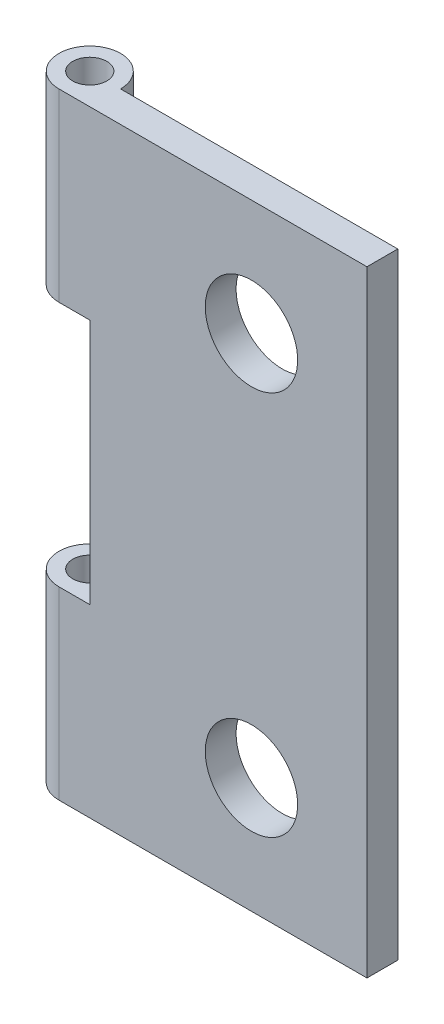
ISO-10303-21;
HEADER;
FILE_DESCRIPTION(('STEP AP214'),'2;1');
FILE_NAME('part.step','',(''),(''),'','','');
FILE_SCHEMA(('AUTOMOTIVE_DESIGN { 1 0 10303 214 1 1 1 1 }'));
ENDSEC;
DATA;
#1=APPLICATION_CONTEXT('core data for automotive mechanical design processes');
#2=APPLICATION_PROTOCOL_DEFINITION('international standard','automotive_design',2000,#1);
#3=PRODUCT_CONTEXT('',#1,'mechanical');
#4=PRODUCT('Part','Part','',(#3));
#5=PRODUCT_RELATED_PRODUCT_CATEGORY('part','',(#4));
#6=PRODUCT_DEFINITION_FORMATION('','',#4);
#7=PRODUCT_DEFINITION_CONTEXT('part definition',#1,'design');
#8=PRODUCT_DEFINITION('design','',#6,#7);
#9=PRODUCT_DEFINITION_SHAPE('','',#8);
#10=(LENGTH_UNIT() NAMED_UNIT(*) SI_UNIT(.MILLI.,.METRE.));
#11=(NAMED_UNIT(*) PLANE_ANGLE_UNIT() SI_UNIT($,.RADIAN.));
#12=(NAMED_UNIT(*) SI_UNIT($,.STERADIAN.) SOLID_ANGLE_UNIT());
#13=UNCERTAINTY_MEASURE_WITH_UNIT(LENGTH_MEASURE(1.E-05),#10,'distance_accuracy_value','');
#14=(GEOMETRIC_REPRESENTATION_CONTEXT(3) GLOBAL_UNCERTAINTY_ASSIGNED_CONTEXT((#13)) GLOBAL_UNIT_ASSIGNED_CONTEXT((#10,
#11,#12)) REPRESENTATION_CONTEXT('',''));
#15=CARTESIAN_POINT('',(0.,0.,0.));
#16=DIRECTION('',(0.,0.,1.));
#17=DIRECTION('',(1.,0.,0.));
#18=AXIS2_PLACEMENT_3D('',#15,#16,#17);
#19=CARTESIAN_POINT('',(-10.,40.,-1.));
#20=DIRECTION('',(0.,-1.,0.));
#21=DIRECTION('',(0.,0.,-1.));
#22=AXIS2_PLACEMENT_3D('',#19,#20,#21);
#23=CYLINDRICAL_SURFACE('',#22,2.);
#24=CARTESIAN_POINT('',(-10.,12.,-1.));
#25=DIRECTION('',(0.,1.,0.));
#26=DIRECTION('',(0.,0.,1.));
#27=AXIS2_PLACEMENT_3D('',#24,#25,#26);
#28=CIRCLE('',#27,2.);
#29=CARTESIAN_POINT('',(-8.,12.,-1.));
#30=VERTEX_POINT('',#29);
#31=CARTESIAN_POINT('',(-10.,12.,1.));
#32=VERTEX_POINT('',#31);
#33=EDGE_CURVE('E126',#30,#32,#28,.T.);
#34=ORIENTED_EDGE('',*,*,#33,.F.);
#35=DIRECTION('',(0.,-1.,0.));
#36=VECTOR('',#35,1.);
#37=CARTESIAN_POINT('',(-8.,40.,-1.));
#38=LINE('',#37,#36);
#39=CARTESIAN_POINT('',(-8.,0.,-1.));
#40=VERTEX_POINT('',#39);
#41=EDGE_CURVE('E96',#30,#40,#38,.T.);
#42=ORIENTED_EDGE('',*,*,#41,.T.);
#43=CARTESIAN_POINT('',(-10.,0.,-1.));
#44=DIRECTION('',(0.,1.,0.));
#45=DIRECTION('',(0.,0.,1.));
#46=AXIS2_PLACEMENT_3D('',#43,#44,#45);
#47=CIRCLE('',#46,2.);
#48=CARTESIAN_POINT('',(-10.,0.,1.));
#49=VERTEX_POINT('',#48);
#50=EDGE_CURVE('E125',#40,#49,#47,.T.);
#51=ORIENTED_EDGE('',*,*,#50,.T.);
#52=DIRECTION('',(0.,-1.,0.));
#53=VECTOR('',#52,1.);
#54=CARTESIAN_POINT('',(-10.,40.,1.));
#55=LINE('',#54,#53);
#56=EDGE_CURVE('E56',#32,#49,#55,.T.);
#57=ORIENTED_EDGE('',*,*,#56,.F.);
#58=EDGE_LOOP('',(#34,#42,#51,#57));
#59=FACE_BOUND('',#58,.T.);
#60=ADVANCED_FACE('F47',(#59),#23,.T.);
#61=CARTESIAN_POINT('',(0.,40.,1.));
#62=DIRECTION('',(0.,0.,-1.));
#63=DIRECTION('',(-1.,0.,0.));
#64=AXIS2_PLACEMENT_3D('',#61,#62,#63);
#65=PLANE('',#64);
#66=CARTESIAN_POINT('',(2.5,32.5,1.));
#67=DIRECTION('',(0.,0.,-1.));
#68=DIRECTION('',(-1.,0.,0.));
#69=AXIS2_PLACEMENT_3D('',#66,#67,#68);
#70=CIRCLE('',#69,3.);
#71=CARTESIAN_POINT('',(-0.500000000000003,32.5,1.));
#72=VERTEX_POINT('',#71);
#73=EDGE_CURVE('E133',#72,#72,#70,.T.);
#74=ORIENTED_EDGE('',*,*,#73,.T.);
#75=EDGE_LOOP('',(#74));
#76=FACE_BOUND('',#75,.T.);
#77=CARTESIAN_POINT('',(2.5,7.5,1.));
#78=DIRECTION('',(0.,0.,-1.));
#79=DIRECTION('',(-1.,0.,0.));
#80=AXIS2_PLACEMENT_3D('',#77,#78,#79);
#81=CIRCLE('',#80,3.);
#82=CARTESIAN_POINT('',(-0.500000000000002,7.5,1.));
#83=VERTEX_POINT('',#82);
#84=EDGE_CURVE('E242',#83,#83,#81,.T.);
#85=ORIENTED_EDGE('',*,*,#84,.T.);
#86=EDGE_LOOP('',(#85));
#87=FACE_BOUND('',#86,.T.);
#88=DIRECTION('',(1.,0.,0.));
#89=VECTOR('',#88,1.);
#90=CARTESIAN_POINT('',(0.,12.,1.));
#91=LINE('',#90,#89);
#92=CARTESIAN_POINT('',(-8.,12.,1.));
#93=VERTEX_POINT('',#92);
#94=EDGE_CURVE('E143',#32,#93,#91,.T.);
#95=ORIENTED_EDGE('',*,*,#94,.F.);
#96=ORIENTED_EDGE('',*,*,#56,.T.);
#97=DIRECTION('',(1.,0.,0.));
#98=VECTOR('',#97,1.);
#99=CARTESIAN_POINT('',(0.,0.,1.));
#100=LINE('',#99,#98);
#101=CARTESIAN_POINT('',(10.,0.,1.));
#102=VERTEX_POINT('',#101);
#103=EDGE_CURVE('E159',#49,#102,#100,.T.);
#104=ORIENTED_EDGE('',*,*,#103,.T.);
#105=DIRECTION('',(0.,-1.,0.));
#106=VECTOR('',#105,1.);
#107=CARTESIAN_POINT('',(10.,40.,1.));
#108=LINE('',#107,#106);
#109=CARTESIAN_POINT('',(10.,40.,1.));
#110=VERTEX_POINT('',#109);
#111=EDGE_CURVE('E174',#110,#102,#108,.T.);
#112=ORIENTED_EDGE('',*,*,#111,.F.);
#113=DIRECTION('',(1.,0.,0.));
#114=VECTOR('',#113,1.);
#115=CARTESIAN_POINT('',(0.,40.,1.));
#116=LINE('',#115,#114);
#117=CARTESIAN_POINT('',(-10.,40.,1.));
#118=VERTEX_POINT('',#117);
#119=EDGE_CURVE('E103',#118,#110,#116,.T.);
#120=ORIENTED_EDGE('',*,*,#119,.F.);
#121=CARTESIAN_POINT('',(-10.,28.,1.));
#122=VERTEX_POINT('',#121);
#123=EDGE_CURVE('E11',#118,#122,#55,.T.);
#124=ORIENTED_EDGE('',*,*,#123,.T.);
#125=DIRECTION('',(1.,0.,0.));
#126=VECTOR('',#125,1.);
#127=CARTESIAN_POINT('',(0.,28.,1.));
#128=LINE('',#127,#126);
#129=CARTESIAN_POINT('',(-8.,28.,1.));
#130=VERTEX_POINT('',#129);
#131=EDGE_CURVE('E131',#122,#130,#128,.T.);
#132=ORIENTED_EDGE('',*,*,#131,.T.);
#133=DIRECTION('',(0.,-1.,0.));
#134=VECTOR('',#133,1.);
#135=CARTESIAN_POINT('',(-8.,40.,1.));
#136=LINE('',#135,#134);
#137=EDGE_CURVE('E119',#130,#93,#136,.T.);
#138=ORIENTED_EDGE('',*,*,#137,.T.);
#139=EDGE_LOOP('',(#95,#96,#104,#112,#120,#124,#132,#138));
#140=FACE_BOUND('',#139,.T.);
#141=ADVANCED_FACE('F135',(#76,#87,#140),#65,.F.);
#142=CARTESIAN_POINT('',(-10.,40.,-1.));
#143=DIRECTION('',(0.,-1.,0.));
#144=DIRECTION('',(0.,0.,-1.));
#145=AXIS2_PLACEMENT_3D('',#142,#143,#144);
#146=CYLINDRICAL_SURFACE('',#145,1.10743887362337);
#147=CARTESIAN_POINT('',(-10.,0.,-1.));
#148=DIRECTION('',(0.,1.,0.));
#149=DIRECTION('',(0.,0.,1.));
#150=AXIS2_PLACEMENT_3D('',#147,#148,#149);
#151=CIRCLE('',#150,1.10743887362337);
#152=CARTESIAN_POINT('',(-10.,0.,0.10743887362337));
#153=VERTEX_POINT('',#152);
#154=EDGE_CURVE('E148',#153,#153,#151,.T.);
#155=ORIENTED_EDGE('',*,*,#154,.F.);
#156=EDGE_LOOP('',(#155));
#157=FACE_BOUND('',#156,.T.);
#158=CARTESIAN_POINT('',(-10.,12.,-1.));
#159=DIRECTION('',(0.,1.,0.));
#160=DIRECTION('',(0.,0.,1.));
#161=AXIS2_PLACEMENT_3D('',#158,#159,#160);
#162=CIRCLE('',#161,1.10743887362337);
#163=CARTESIAN_POINT('',(-10.,12.,0.10743887362337));
#164=VERTEX_POINT('',#163);
#165=EDGE_CURVE('E51',#164,#164,#162,.T.);
#166=ORIENTED_EDGE('',*,*,#165,.T.);
#167=EDGE_LOOP('',(#166));
#168=FACE_BOUND('',#167,.T.);
#169=ADVANCED_FACE('F189',(#157,#168),#146,.F.);
#170=CARTESIAN_POINT('',(-8.,40.,-1.));
#171=VERTEX_POINT('',#170);
#172=CARTESIAN_POINT('',(-8.,28.,-1.));
#173=VERTEX_POINT('',#172);
#174=EDGE_CURVE('E73',#171,#173,#38,.T.);
#175=ORIENTED_EDGE('',*,*,#174,.T.);
#176=CARTESIAN_POINT('',(-10.,28.,-1.));
#177=DIRECTION('',(0.,1.,0.));
#178=DIRECTION('',(0.,0.,1.));
#179=AXIS2_PLACEMENT_3D('',#176,#177,#178);
#180=CIRCLE('',#179,2.);
#181=EDGE_CURVE('E132',#173,#122,#180,.T.);
#182=ORIENTED_EDGE('',*,*,#181,.T.);
#183=ORIENTED_EDGE('',*,*,#123,.F.);
#184=CARTESIAN_POINT('',(-10.,40.,-1.));
#185=DIRECTION('',(0.,1.,0.));
#186=DIRECTION('',(0.,0.,1.));
#187=AXIS2_PLACEMENT_3D('',#184,#185,#186);
#188=CIRCLE('',#187,2.);
#189=EDGE_CURVE('E146',#171,#118,#188,.T.);
#190=ORIENTED_EDGE('',*,*,#189,.F.);
#191=EDGE_LOOP('',(#175,#182,#183,#190));
#192=FACE_BOUND('',#191,.T.);
#193=ADVANCED_FACE('F49',(#192),#23,.T.);
#194=CARTESIAN_POINT('',(10.,40.,0.));
#195=DIRECTION('',(1.,0.,0.));
#196=DIRECTION('',(0.,0.,-1.));
#197=AXIS2_PLACEMENT_3D('',#194,#195,#196);
#198=PLANE('',#197);
#199=DIRECTION('',(0.,0.,1.));
#200=VECTOR('',#199,1.);
#201=CARTESIAN_POINT('',(10.,0.,0.));
#202=LINE('',#201,#200);
#203=CARTESIAN_POINT('',(10.,0.,-1.));
#204=VERTEX_POINT('',#203);
#205=EDGE_CURVE('E162',#204,#102,#202,.T.);
#206=ORIENTED_EDGE('',*,*,#205,.F.);
#207=DIRECTION('',(0.,-1.,0.));
#208=VECTOR('',#207,1.);
#209=CARTESIAN_POINT('',(10.,40.,-1.));
#210=LINE('',#209,#208);
#211=CARTESIAN_POINT('',(10.,40.,-1.));
#212=VERTEX_POINT('',#211);
#213=EDGE_CURVE('E171',#212,#204,#210,.T.);
#214=ORIENTED_EDGE('',*,*,#213,.F.);
#215=DIRECTION('',(0.,0.,1.));
#216=VECTOR('',#215,1.);
#217=CARTESIAN_POINT('',(10.,40.,0.));
#218=LINE('',#217,#216);
#219=EDGE_CURVE('E150',#212,#110,#218,.T.);
#220=ORIENTED_EDGE('',*,*,#219,.T.);
#221=ORIENTED_EDGE('',*,*,#111,.T.);
#222=EDGE_LOOP('',(#206,#214,#220,#221));
#223=FACE_BOUND('',#222,.T.);
#224=ADVANCED_FACE('F192',(#223),#198,.T.);
#225=CARTESIAN_POINT('',(0.,40.,-1.));
#226=DIRECTION('',(0.,0.,-1.));
#227=DIRECTION('',(-1.,0.,0.));
#228=AXIS2_PLACEMENT_3D('',#225,#226,#227);
#229=PLANE('',#228);
#230=CARTESIAN_POINT('',(2.5,32.5,-1.));
#231=DIRECTION('',(0.,0.,-1.));
#232=DIRECTION('',(-1.,0.,0.));
#233=AXIS2_PLACEMENT_3D('',#230,#231,#232);
#234=CIRCLE('',#233,3.);
#235=CARTESIAN_POINT('',(-0.500000000000003,32.5,-1.));
#236=VERTEX_POINT('',#235);
#237=EDGE_CURVE('E236',#236,#236,#234,.T.);
#238=ORIENTED_EDGE('',*,*,#237,.F.);
#239=EDGE_LOOP('',(#238));
#240=FACE_BOUND('',#239,.T.);
#241=CARTESIAN_POINT('',(2.5,7.5,-1.));
#242=DIRECTION('',(0.,0.,-1.));
#243=DIRECTION('',(-1.,0.,0.));
#244=AXIS2_PLACEMENT_3D('',#241,#242,#243);
#245=CIRCLE('',#244,3.);
#246=CARTESIAN_POINT('',(-0.500000000000002,7.5,-1.));
#247=VERTEX_POINT('',#246);
#248=EDGE_CURVE('E239',#247,#247,#245,.T.);
#249=ORIENTED_EDGE('',*,*,#248,.F.);
#250=EDGE_LOOP('',(#249));
#251=FACE_BOUND('',#250,.T.);
#252=DIRECTION('',(1.,0.,0.));
#253=VECTOR('',#252,1.);
#254=CARTESIAN_POINT('',(0.,0.,-1.));
#255=LINE('',#254,#253);
#256=EDGE_CURVE('E165',#40,#204,#255,.T.);
#257=ORIENTED_EDGE('',*,*,#256,.F.);
#258=ORIENTED_EDGE('',*,*,#41,.F.);
#259=EDGE_CURVE('E172',#173,#30,#38,.T.);
#260=ORIENTED_EDGE('',*,*,#259,.F.);
#261=ORIENTED_EDGE('',*,*,#174,.F.);
#262=DIRECTION('',(1.,0.,0.));
#263=VECTOR('',#262,1.);
#264=CARTESIAN_POINT('',(0.,40.,-1.));
#265=LINE('',#264,#263);
#266=EDGE_CURVE('E153',#171,#212,#265,.T.);
#267=ORIENTED_EDGE('',*,*,#266,.T.);
#268=ORIENTED_EDGE('',*,*,#213,.T.);
#269=EDGE_LOOP('',(#257,#258,#260,#261,#267,#268));
#270=FACE_BOUND('',#269,.T.);
#271=ADVANCED_FACE('F198',(#240,#251,#270),#229,.T.);
#272=CARTESIAN_POINT('',(-10.,28.,-1.));
#273=DIRECTION('',(0.,1.,0.));
#274=DIRECTION('',(0.,0.,1.));
#275=AXIS2_PLACEMENT_3D('',#272,#273,#274);
#276=CIRCLE('',#275,1.10743887362337);
#277=CARTESIAN_POINT('',(-10.,28.,0.10743887362337));
#278=VERTEX_POINT('',#277);
#279=EDGE_CURVE('E137',#278,#278,#276,.T.);
#280=ORIENTED_EDGE('',*,*,#279,.F.);
#281=EDGE_LOOP('',(#280));
#282=FACE_BOUND('',#281,.T.);
#283=CARTESIAN_POINT('',(-10.,40.,-1.));
#284=DIRECTION('',(0.,1.,0.));
#285=DIRECTION('',(0.,0.,1.));
#286=AXIS2_PLACEMENT_3D('',#283,#284,#285);
#287=CIRCLE('',#286,1.10743887362337);
#288=CARTESIAN_POINT('',(-10.,40.,0.10743887362337));
#289=VERTEX_POINT('',#288);
#290=EDGE_CURVE('E155',#289,#289,#287,.T.);
#291=ORIENTED_EDGE('',*,*,#290,.T.);
#292=EDGE_LOOP('',(#291));
#293=FACE_BOUND('',#292,.T.);
#294=ADVANCED_FACE('F202',(#282,#293),#146,.F.);
#295=CARTESIAN_POINT('',(0.,40.,0.));
#296=DIRECTION('',(0.,1.,0.));
#297=DIRECTION('',(0.,0.,1.));
#298=AXIS2_PLACEMENT_3D('',#295,#296,#297);
#299=PLANE('',#298);
#300=ORIENTED_EDGE('',*,*,#189,.T.);
#301=ORIENTED_EDGE('',*,*,#119,.T.);
#302=ORIENTED_EDGE('',*,*,#219,.F.);
#303=ORIENTED_EDGE('',*,*,#266,.F.);
#304=EDGE_LOOP('',(#300,#301,#302,#303));
#305=FACE_BOUND('',#304,.T.);
#306=ORIENTED_EDGE('',*,*,#290,.F.);
#307=EDGE_LOOP('',(#306));
#308=FACE_BOUND('',#307,.T.);
#309=ADVANCED_FACE('F206',(#305,#308),#299,.T.);
#310=CARTESIAN_POINT('',(0.,0.,0.));
#311=DIRECTION('',(0.,1.,0.));
#312=DIRECTION('',(0.,0.,1.));
#313=AXIS2_PLACEMENT_3D('',#310,#311,#312);
#314=PLANE('',#313);
#315=ORIENTED_EDGE('',*,*,#50,.F.);
#316=ORIENTED_EDGE('',*,*,#256,.T.);
#317=ORIENTED_EDGE('',*,*,#205,.T.);
#318=ORIENTED_EDGE('',*,*,#103,.F.);
#319=EDGE_LOOP('',(#315,#316,#317,#318));
#320=FACE_BOUND('',#319,.T.);
#321=ORIENTED_EDGE('',*,*,#154,.T.);
#322=EDGE_LOOP('',(#321));
#323=FACE_BOUND('',#322,.T.);
#324=ADVANCED_FACE('F180',(#320,#323),#314,.F.);
#325=CARTESIAN_POINT('',(-8.,0.,-41.));
#326=DIRECTION('',(1.,0.,0.));
#327=DIRECTION('',(0.,0.,-1.));
#328=AXIS2_PLACEMENT_3D('',#325,#326,#327);
#329=PLANE('',#328);
#330=DIRECTION('',(0.,0.,1.));
#331=VECTOR('',#330,1.);
#332=CARTESIAN_POINT('',(-8.,28.,-41.));
#333=LINE('',#332,#331);
#334=EDGE_CURVE('E64',#173,#130,#333,.T.);
#335=ORIENTED_EDGE('',*,*,#334,.F.);
#336=ORIENTED_EDGE('',*,*,#259,.T.);
#337=DIRECTION('',(0.,0.,1.));
#338=VECTOR('',#337,1.);
#339=CARTESIAN_POINT('',(-8.,12.,-41.));
#340=LINE('',#339,#338);
#341=EDGE_CURVE('E122',#30,#93,#340,.T.);
#342=ORIENTED_EDGE('',*,*,#341,.T.);
#343=ORIENTED_EDGE('',*,*,#137,.F.);
#344=EDGE_LOOP('',(#335,#336,#342,#343));
#345=FACE_BOUND('',#344,.T.);
#346=ADVANCED_FACE('F120',(#345),#329,.F.);
#347=CARTESIAN_POINT('',(0.,12.,-41.));
#348=DIRECTION('',(0.,1.,0.));
#349=DIRECTION('',(0.,0.,1.));
#350=AXIS2_PLACEMENT_3D('',#347,#348,#349);
#351=PLANE('',#350);
#352=ORIENTED_EDGE('',*,*,#165,.F.);
#353=EDGE_LOOP('',(#352));
#354=FACE_BOUND('',#353,.T.);
#355=ORIENTED_EDGE('',*,*,#33,.T.);
#356=ORIENTED_EDGE('',*,*,#94,.T.);
#357=ORIENTED_EDGE('',*,*,#341,.F.);
#358=EDGE_LOOP('',(#355,#356,#357));
#359=FACE_BOUND('',#358,.T.);
#360=ADVANCED_FACE('F209',(#354,#359),#351,.T.);
#361=CARTESIAN_POINT('',(0.,28.,-41.));
#362=DIRECTION('',(0.,1.,0.));
#363=DIRECTION('',(0.,0.,1.));
#364=AXIS2_PLACEMENT_3D('',#361,#362,#363);
#365=PLANE('',#364);
#366=ORIENTED_EDGE('',*,*,#279,.T.);
#367=EDGE_LOOP('',(#366));
#368=FACE_BOUND('',#367,.T.);
#369=ORIENTED_EDGE('',*,*,#334,.T.);
#370=ORIENTED_EDGE('',*,*,#131,.F.);
#371=ORIENTED_EDGE('',*,*,#181,.F.);
#372=EDGE_LOOP('',(#369,#370,#371));
#373=FACE_BOUND('',#372,.T.);
#374=ADVANCED_FACE('F130',(#368,#373),#365,.F.);
#375=CARTESIAN_POINT('',(2.5,7.5,9.));
#376=DIRECTION('',(0.,0.,-1.));
#377=DIRECTION('',(-1.,0.,0.));
#378=AXIS2_PLACEMENT_3D('',#375,#376,#377);
#379=CYLINDRICAL_SURFACE('',#378,3.);
#380=ORIENTED_EDGE('',*,*,#248,.T.);
#381=EDGE_LOOP('',(#380));
#382=FACE_BOUND('',#381,.T.);
#383=ORIENTED_EDGE('',*,*,#84,.F.);
#384=EDGE_LOOP('',(#383));
#385=FACE_BOUND('',#384,.T.);
#386=ADVANCED_FACE('F217',(#382,#385),#379,.F.);
#387=CARTESIAN_POINT('',(2.5,32.5,9.));
#388=DIRECTION('',(0.,0.,-1.));
#389=DIRECTION('',(-1.,0.,0.));
#390=AXIS2_PLACEMENT_3D('',#387,#388,#389);
#391=CYLINDRICAL_SURFACE('',#390,3.);
#392=ORIENTED_EDGE('',*,*,#237,.T.);
#393=EDGE_LOOP('',(#392));
#394=FACE_BOUND('',#393,.T.);
#395=ORIENTED_EDGE('',*,*,#73,.F.);
#396=EDGE_LOOP('',(#395));
#397=FACE_BOUND('',#396,.T.);
#398=ADVANCED_FACE('F251',(#394,#397),#391,.F.);
#399=CLOSED_SHELL('',(#60,#141,#169,#193,#224,#271,#294,#309,#324,#346,#360,#374,#386,#398));
#400=MANIFOLD_SOLID_BREP('B2',#399);
#401=ADVANCED_BREP_SHAPE_REPRESENTATION('',(#18,#400),#14);
#402=SHAPE_DEFINITION_REPRESENTATION(#9,#401);
ENDSEC;
END-ISO-10303-21;
